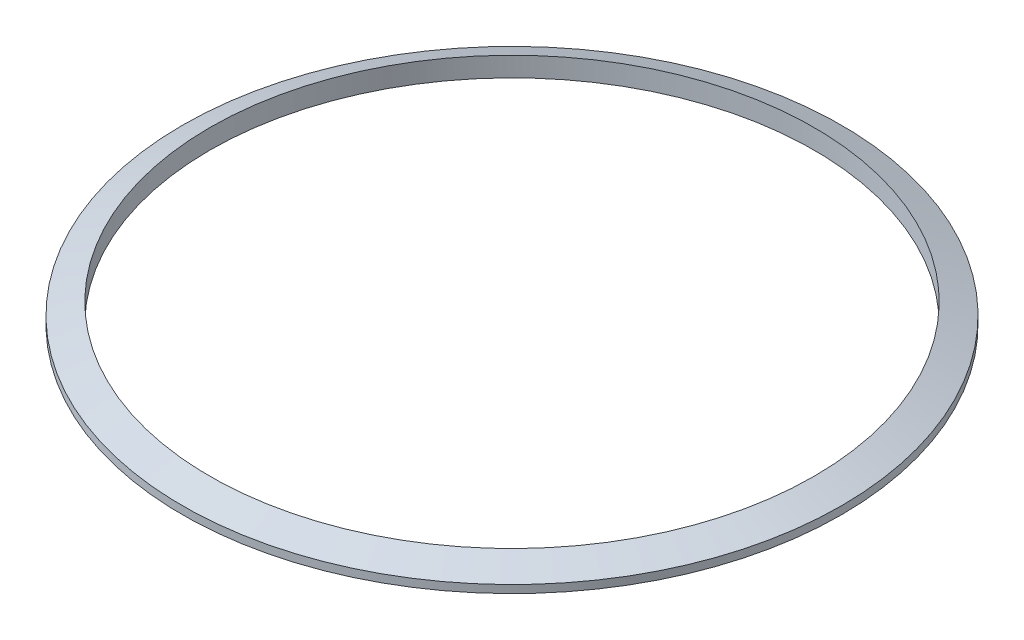
ISO-10303-21;
HEADER;
FILE_DESCRIPTION(('STEP AP214'),'2;1');
FILE_NAME('part.step','',(''),(''),'','','');
FILE_SCHEMA(('AUTOMOTIVE_DESIGN { 1 0 10303 214 1 1 1 1 }'));
ENDSEC;
DATA;
#1=APPLICATION_CONTEXT('core data for automotive mechanical design processes');
#2=APPLICATION_PROTOCOL_DEFINITION('international standard','automotive_design',2000,#1);
#3=PRODUCT_CONTEXT('',#1,'mechanical');
#4=PRODUCT('Part','Part','',(#3));
#5=PRODUCT_RELATED_PRODUCT_CATEGORY('part','',(#4));
#6=PRODUCT_DEFINITION_FORMATION('','',#4);
#7=PRODUCT_DEFINITION_CONTEXT('part definition',#1,'design');
#8=PRODUCT_DEFINITION('design','',#6,#7);
#9=PRODUCT_DEFINITION_SHAPE('','',#8);
#10=(LENGTH_UNIT() NAMED_UNIT(*) SI_UNIT(.MILLI.,.METRE.));
#11=(NAMED_UNIT(*) PLANE_ANGLE_UNIT() SI_UNIT($,.RADIAN.));
#12=(NAMED_UNIT(*) SI_UNIT($,.STERADIAN.) SOLID_ANGLE_UNIT());
#13=UNCERTAINTY_MEASURE_WITH_UNIT(LENGTH_MEASURE(1.E-05),#10,'distance_accuracy_value','');
#14=(GEOMETRIC_REPRESENTATION_CONTEXT(3) GLOBAL_UNCERTAINTY_ASSIGNED_CONTEXT((#13)) GLOBAL_UNIT_ASSIGNED_CONTEXT((#10,
#11,#12)) REPRESENTATION_CONTEXT('',''));
#15=CARTESIAN_POINT('',(0.,0.,0.));
#16=DIRECTION('',(0.,0.,1.));
#17=DIRECTION('',(1.,0.,0.));
#18=AXIS2_PLACEMENT_3D('',#15,#16,#17);
#19=CARTESIAN_POINT('',(0.,-0.25,0.));
#20=DIRECTION('',(0.,1.,0.));
#21=DIRECTION('',(1.,0.,0.));
#22=AXIS2_PLACEMENT_3D('',#19,#20,#21);
#23=CYLINDRICAL_SURFACE('',#22,84.);
#24=CARTESIAN_POINT('',(0.,2.,0.));
#25=DIRECTION('',(0.,1.,0.));
#26=DIRECTION('',(1.,0.,0.));
#27=AXIS2_PLACEMENT_3D('',#24,#25,#26);
#28=CIRCLE('',#27,84.);
#29=CARTESIAN_POINT('',(-84.,2.,0.));
#30=VERTEX_POINT('',#29);
#31=CARTESIAN_POINT('',(84.,1.99999999999989,0.));
#32=VERTEX_POINT('',#31);
#33=EDGE_CURVE('E21',#30,#32,#28,.T.);
#34=ORIENTED_EDGE('',*,*,#33,.F.);
#35=DIRECTION('',(0.,-1.,0.));
#36=VECTOR('',#35,1.);
#37=CARTESIAN_POINT('',(-84.,-0.25,0.));
#38=LINE('',#37,#36);
#39=CARTESIAN_POINT('',(-84.,0.,0.));
#40=VERTEX_POINT('',#39);
#41=EDGE_CURVE('E11',#30,#40,#38,.T.);
#42=ORIENTED_EDGE('',*,*,#41,.T.);
#43=CARTESIAN_POINT('',(0.,0.,0.));
#44=DIRECTION('',(0.,-1.,0.));
#45=DIRECTION('',(1.,0.,0.));
#46=AXIS2_PLACEMENT_3D('',#43,#44,#45);
#47=CIRCLE('',#46,84.);
#48=EDGE_CURVE('E74',#40,#40,#47,.T.);
#49=ORIENTED_EDGE('',*,*,#48,.F.);
#50=ORIENTED_EDGE('',*,*,#41,.F.);
#51=CARTESIAN_POINT('',(0.,2.,0.));
#52=DIRECTION('',(0.,1.,0.));
#53=DIRECTION('',(1.,0.,0.));
#54=AXIS2_PLACEMENT_3D('',#51,#52,#53);
#55=CIRCLE('',#54,84.);
#56=EDGE_CURVE('E28',#32,#30,#55,.T.);
#57=ORIENTED_EDGE('',*,*,#56,.F.);
#58=EDGE_LOOP('',(#34,#42,#49,#50,#57));
#59=FACE_BOUND('',#58,.T.);
#60=ADVANCED_FACE('F17',(#59),#23,.T.);
#61=CARTESIAN_POINT('',(0.,3.5,0.));
#62=DIRECTION('',(0.,-1.,0.));
#63=DIRECTION('',(-1.,0.,0.));
#64=AXIS2_PLACEMENT_3D('',#61,#62,#63);
#65=CONICAL_SURFACE('',#64,80.5,1.16590454050978);
#66=ORIENTED_EDGE('',*,*,#33,.T.);
#67=DIRECTION('',(-0.919145030018045,0.393919298579197,0.));
#68=VECTOR('',#67,1.);
#69=CARTESIAN_POINT('',(80.5,3.5,0.));
#70=LINE('',#69,#68);
#71=CARTESIAN_POINT('',(77.,5.00000000000012,0.));
#72=VERTEX_POINT('',#71);
#73=EDGE_CURVE('E52',#32,#72,#70,.T.);
#74=ORIENTED_EDGE('',*,*,#73,.T.);
#75=CARTESIAN_POINT('',(0.,5.,0.));
#76=DIRECTION('',(0.,1.,0.));
#77=DIRECTION('',(1.,0.,0.));
#78=AXIS2_PLACEMENT_3D('',#75,#76,#77);
#79=CIRCLE('',#78,77.);
#80=CARTESIAN_POINT('',(-77.,5.,0.));
#81=VERTEX_POINT('',#80);
#82=EDGE_CURVE('E86',#81,#72,#79,.T.);
#83=ORIENTED_EDGE('',*,*,#82,.F.);
#84=CARTESIAN_POINT('',(0.,5.,0.));
#85=DIRECTION('',(0.,1.,0.));
#86=DIRECTION('',(1.,0.,0.));
#87=AXIS2_PLACEMENT_3D('',#84,#85,#86);
#88=CIRCLE('',#87,77.);
#89=EDGE_CURVE('E61',#72,#81,#88,.T.);
#90=ORIENTED_EDGE('',*,*,#89,.F.);
#91=ORIENTED_EDGE('',*,*,#73,.F.);
#92=ORIENTED_EDGE('',*,*,#56,.T.);
#93=EDGE_LOOP('',(#66,#74,#83,#90,#91,#92));
#94=FACE_BOUND('',#93,.T.);
#95=ADVANCED_FACE('F19',(#94),#65,.T.);
#96=CARTESIAN_POINT('',(0.,-0.25,0.));
#97=DIRECTION('',(0.,1.,0.));
#98=DIRECTION('',(1.,0.,0.));
#99=AXIS2_PLACEMENT_3D('',#96,#97,#98);
#100=CYLINDRICAL_SURFACE('',#99,77.);
#101=CARTESIAN_POINT('',(0.,0.,0.));
#102=DIRECTION('',(0.,1.,0.));
#103=DIRECTION('',(1.,0.,0.));
#104=AXIS2_PLACEMENT_3D('',#101,#102,#103);
#105=CIRCLE('',#104,77.);
#106=CARTESIAN_POINT('',(-77.,0.,0.));
#107=VERTEX_POINT('',#106);
#108=EDGE_CURVE('E78',#107,#107,#105,.T.);
#109=ORIENTED_EDGE('',*,*,#108,.F.);
#110=DIRECTION('',(0.,1.,0.));
#111=VECTOR('',#110,1.);
#112=CARTESIAN_POINT('',(-77.,-0.25,0.));
#113=LINE('',#112,#111);
#114=EDGE_CURVE('E69',#107,#81,#113,.T.);
#115=ORIENTED_EDGE('',*,*,#114,.T.);
#116=ORIENTED_EDGE('',*,*,#82,.T.);
#117=ORIENTED_EDGE('',*,*,#89,.T.);
#118=ORIENTED_EDGE('',*,*,#114,.F.);
#119=EDGE_LOOP('',(#109,#115,#116,#117,#118));
#120=FACE_BOUND('',#119,.T.);
#121=ADVANCED_FACE('F105',(#120),#100,.F.);
#122=CARTESIAN_POINT('',(0.,0.,0.));
#123=DIRECTION('',(0.,1.,0.));
#124=DIRECTION('',(1.,0.,0.));
#125=AXIS2_PLACEMENT_3D('',#122,#123,#124);
#126=PLANE('',#125);
#127=ORIENTED_EDGE('',*,*,#108,.T.);
#128=EDGE_LOOP('',(#127));
#129=FACE_BOUND('',#128,.T.);
#130=ORIENTED_EDGE('',*,*,#48,.T.);
#131=EDGE_LOOP('',(#130));
#132=FACE_BOUND('',#131,.T.);
#133=ADVANCED_FACE('F76',(#129,#132),#126,.F.);
#134=CLOSED_SHELL('',(#60,#95,#121,#133));
#135=MANIFOLD_SOLID_BREP('B1',#134);
#136=ADVANCED_BREP_SHAPE_REPRESENTATION('',(#18,#135),#14);
#137=SHAPE_DEFINITION_REPRESENTATION(#9,#136);
ENDSEC;
END-ISO-10303-21;
